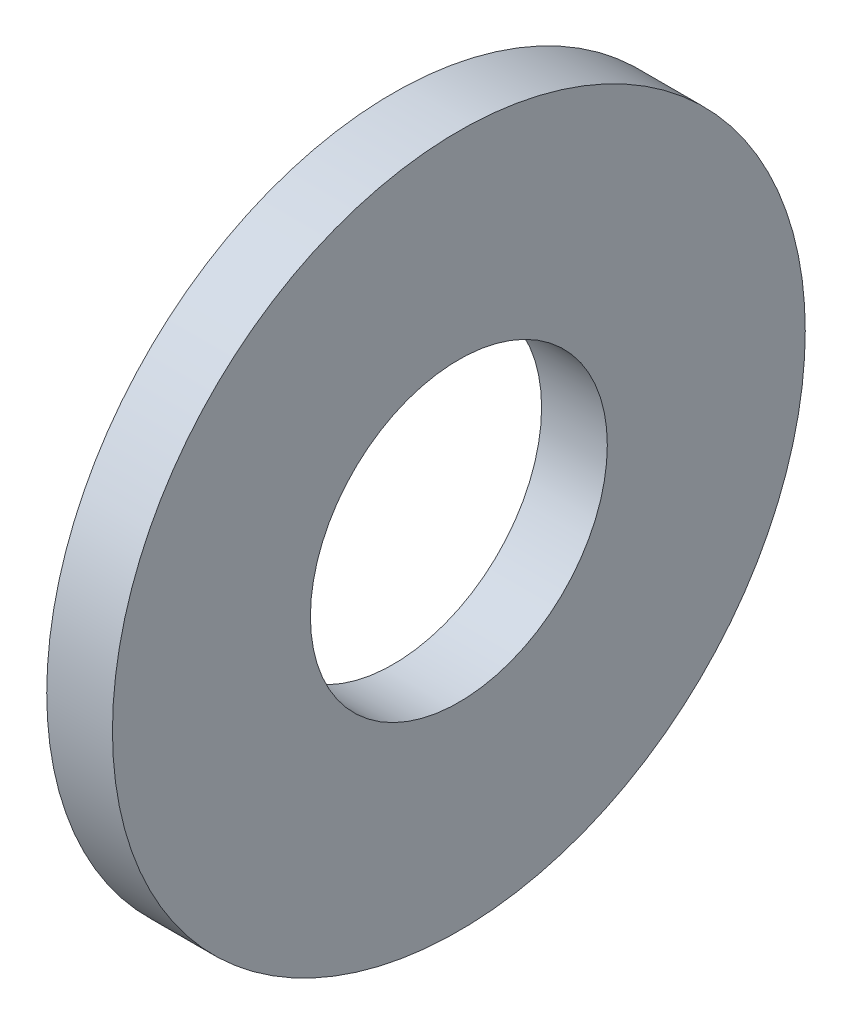
ISO-10303-21;
HEADER;
FILE_DESCRIPTION(('STEP AP214'),'2;1');
FILE_NAME('part.step','',(''),(''),'','','');
FILE_SCHEMA(('AUTOMOTIVE_DESIGN { 1 0 10303 214 1 1 1 1 }'));
ENDSEC;
DATA;
#1=APPLICATION_CONTEXT('core data for automotive mechanical design processes');
#2=APPLICATION_PROTOCOL_DEFINITION('international standard','automotive_design',2000,#1);
#3=PRODUCT_CONTEXT('',#1,'mechanical');
#4=PRODUCT('Part','Part','',(#3));
#5=PRODUCT_RELATED_PRODUCT_CATEGORY('part','',(#4));
#6=PRODUCT_DEFINITION_FORMATION('','',#4);
#7=PRODUCT_DEFINITION_CONTEXT('part definition',#1,'design');
#8=PRODUCT_DEFINITION('design','',#6,#7);
#9=PRODUCT_DEFINITION_SHAPE('','',#8);
#10=(LENGTH_UNIT() NAMED_UNIT(*) SI_UNIT(.MILLI.,.METRE.));
#11=(NAMED_UNIT(*) PLANE_ANGLE_UNIT() SI_UNIT($,.RADIAN.));
#12=(NAMED_UNIT(*) SI_UNIT($,.STERADIAN.) SOLID_ANGLE_UNIT());
#13=UNCERTAINTY_MEASURE_WITH_UNIT(LENGTH_MEASURE(1.E-05),#10,'distance_accuracy_value','');
#14=(GEOMETRIC_REPRESENTATION_CONTEXT(3) GLOBAL_UNCERTAINTY_ASSIGNED_CONTEXT((#13)) GLOBAL_UNIT_ASSIGNED_CONTEXT((#10,
#11,#12)) REPRESENTATION_CONTEXT('',''));
#15=CARTESIAN_POINT('',(0.,0.,0.));
#16=DIRECTION('',(0.,0.,1.));
#17=DIRECTION('',(1.,0.,0.));
#18=AXIS2_PLACEMENT_3D('',#15,#16,#17);
#19=CARTESIAN_POINT('',(2.1082,0.,0.));
#20=DIRECTION('',(1.,0.,0.));
#21=DIRECTION('',(0.,0.,-1.));
#22=AXIS2_PLACEMENT_3D('',#19,#20,#21);
#23=PLANE('',#22);
#24=CARTESIAN_POINT('',(2.1082,0.,0.));
#25=DIRECTION('',(1.,0.,0.));
#26=DIRECTION('',(0.,0.,-1.));
#27=AXIS2_PLACEMENT_3D('',#24,#25,#26);
#28=CIRCLE('',#27,11.1125);
#29=CARTESIAN_POINT('',(2.1082,0.,-11.1125));
#30=VERTEX_POINT('',#29);
#31=EDGE_CURVE('E10',#30,#30,#28,.T.);
#32=ORIENTED_EDGE('',*,*,#31,.T.);
#33=EDGE_LOOP('',(#32));
#34=FACE_BOUND('',#33,.T.);
#35=CARTESIAN_POINT('',(2.1082,0.,0.));
#36=DIRECTION('',(1.,0.,0.));
#37=DIRECTION('',(0.,0.,-1.));
#38=AXIS2_PLACEMENT_3D('',#35,#36,#37);
#39=CIRCLE('',#38,4.7625);
#40=CARTESIAN_POINT('',(2.1082,0.,-4.7625));
#41=VERTEX_POINT('',#40);
#42=EDGE_CURVE('E42',#41,#41,#39,.T.);
#43=ORIENTED_EDGE('',*,*,#42,.F.);
#44=EDGE_LOOP('',(#43));
#45=FACE_BOUND('',#44,.T.);
#46=ADVANCED_FACE('F31',(#34,#45),#23,.T.);
#47=CARTESIAN_POINT('',(0.,0.,0.));
#48=DIRECTION('',(1.,0.,0.));
#49=DIRECTION('',(0.,0.,-1.));
#50=AXIS2_PLACEMENT_3D('',#47,#48,#49);
#51=PLANE('',#50);
#52=CARTESIAN_POINT('',(0.,0.,0.));
#53=DIRECTION('',(1.,0.,0.));
#54=DIRECTION('',(0.,0.,-1.));
#55=AXIS2_PLACEMENT_3D('',#52,#53,#54);
#56=CIRCLE('',#55,11.1125);
#57=CARTESIAN_POINT('',(0.,0.,-11.1125));
#58=VERTEX_POINT('',#57);
#59=EDGE_CURVE('E35',#58,#58,#56,.T.);
#60=ORIENTED_EDGE('',*,*,#59,.F.);
#61=EDGE_LOOP('',(#60));
#62=FACE_BOUND('',#61,.T.);
#63=CARTESIAN_POINT('',(0.,0.,0.));
#64=DIRECTION('',(1.,0.,0.));
#65=DIRECTION('',(0.,0.,-1.));
#66=AXIS2_PLACEMENT_3D('',#63,#64,#65);
#67=CIRCLE('',#66,4.7625);
#68=CARTESIAN_POINT('',(0.,0.,-4.7625));
#69=VERTEX_POINT('',#68);
#70=EDGE_CURVE('E44',#69,#69,#67,.T.);
#71=ORIENTED_EDGE('',*,*,#70,.T.);
#72=EDGE_LOOP('',(#71));
#73=FACE_BOUND('',#72,.T.);
#74=ADVANCED_FACE('F54',(#62,#73),#51,.F.);
#75=CARTESIAN_POINT('',(2.1082,0.,0.));
#76=DIRECTION('',(-1.,0.,0.));
#77=DIRECTION('',(0.,0.,1.));
#78=AXIS2_PLACEMENT_3D('',#75,#76,#77);
#79=CYLINDRICAL_SURFACE('',#78,11.1125);
#80=ORIENTED_EDGE('',*,*,#31,.F.);
#81=EDGE_LOOP('',(#80));
#82=FACE_BOUND('',#81,.T.);
#83=ORIENTED_EDGE('',*,*,#59,.T.);
#84=EDGE_LOOP('',(#83));
#85=FACE_BOUND('',#84,.T.);
#86=ADVANCED_FACE('F33',(#82,#85),#79,.T.);
#87=CARTESIAN_POINT('',(2.1082,0.,0.));
#88=DIRECTION('',(-1.,0.,0.));
#89=DIRECTION('',(0.,0.,1.));
#90=AXIS2_PLACEMENT_3D('',#87,#88,#89);
#91=CYLINDRICAL_SURFACE('',#90,4.7625);
#92=ORIENTED_EDGE('',*,*,#42,.T.);
#93=EDGE_LOOP('',(#92));
#94=FACE_BOUND('',#93,.T.);
#95=ORIENTED_EDGE('',*,*,#70,.F.);
#96=EDGE_LOOP('',(#95));
#97=FACE_BOUND('',#96,.T.);
#98=ADVANCED_FACE('F50',(#94,#97),#91,.F.);
#99=CLOSED_SHELL('',(#46,#74,#86,#98));
#100=MANIFOLD_SOLID_BREP('B2',#99);
#101=ADVANCED_BREP_SHAPE_REPRESENTATION('',(#18,#100),#14);
#102=SHAPE_DEFINITION_REPRESENTATION(#9,#101);
ENDSEC;
END-ISO-10303-21;
